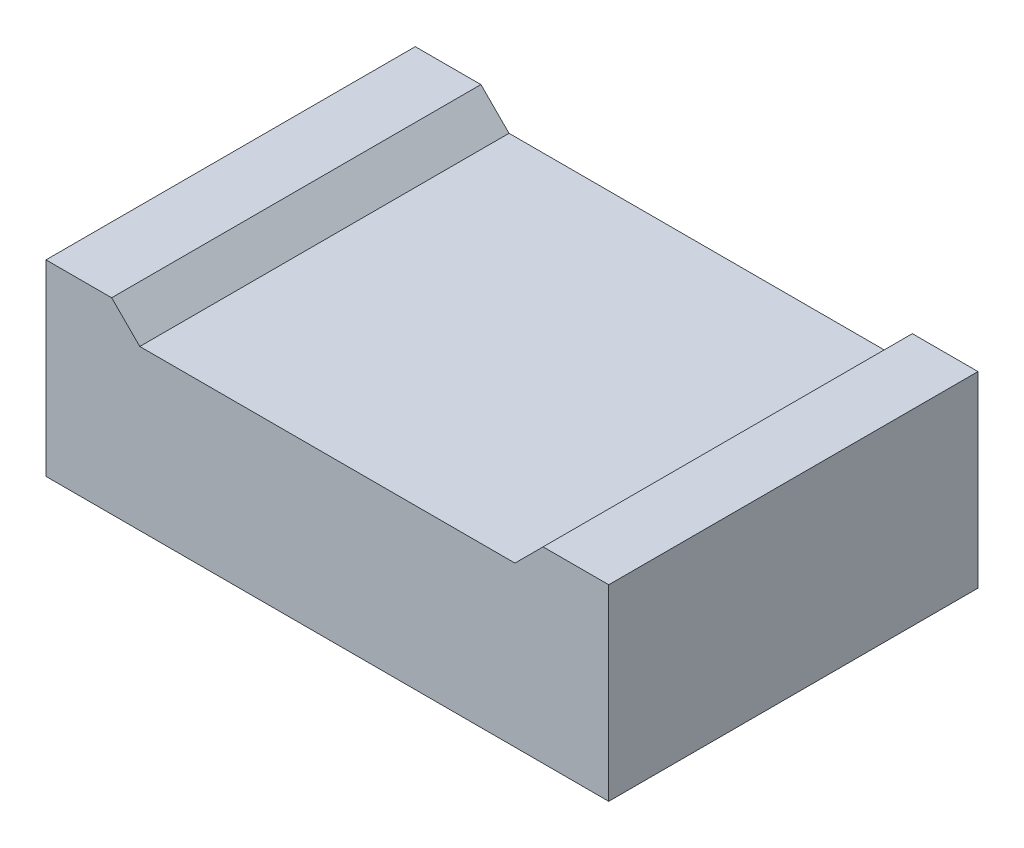
ISO-10303-21;
HEADER;
FILE_DESCRIPTION(('STEP AP214'),'2;1');
FILE_NAME('part.step','',(''),(''),'','','');
FILE_SCHEMA(('AUTOMOTIVE_DESIGN { 1 0 10303 214 1 1 1 1 }'));
ENDSEC;
DATA;
#1=APPLICATION_CONTEXT('core data for automotive mechanical design processes');
#2=APPLICATION_PROTOCOL_DEFINITION('international standard','automotive_design',2000,#1);
#3=PRODUCT_CONTEXT('',#1,'mechanical');
#4=PRODUCT('Part','Part','',(#3));
#5=PRODUCT_RELATED_PRODUCT_CATEGORY('part','',(#4));
#6=PRODUCT_DEFINITION_FORMATION('','',#4);
#7=PRODUCT_DEFINITION_CONTEXT('part definition',#1,'design');
#8=PRODUCT_DEFINITION('design','',#6,#7);
#9=PRODUCT_DEFINITION_SHAPE('','',#8);
#10=(LENGTH_UNIT() NAMED_UNIT(*) SI_UNIT(.MILLI.,.METRE.));
#11=(NAMED_UNIT(*) PLANE_ANGLE_UNIT() SI_UNIT($,.RADIAN.));
#12=(NAMED_UNIT(*) SI_UNIT($,.STERADIAN.) SOLID_ANGLE_UNIT());
#13=UNCERTAINTY_MEASURE_WITH_UNIT(LENGTH_MEASURE(1.E-05),#10,'distance_accuracy_value','');
#14=(GEOMETRIC_REPRESENTATION_CONTEXT(3) GLOBAL_UNCERTAINTY_ASSIGNED_CONTEXT((#13)) GLOBAL_UNIT_ASSIGNED_CONTEXT((#10,
#11,#12)) REPRESENTATION_CONTEXT('',''));
#15=CARTESIAN_POINT('',(0.,0.,0.));
#16=DIRECTION('',(0.,0.,1.));
#17=DIRECTION('',(1.,0.,0.));
#18=AXIS2_PLACEMENT_3D('',#15,#16,#17);
#19=CARTESIAN_POINT('',(-2.921,1.27,0.));
#20=DIRECTION('',(0.707106781186548,0.707106781186548,0.));
#21=DIRECTION('',(-0.707106781186548,0.707106781186548,0.));
#22=AXIS2_PLACEMENT_3D('',#19,#20,#21);
#23=PLANE('',#22);
#24=DIRECTION('',(0.,0.,1.));
#25=VECTOR('',#24,1.);
#26=CARTESIAN_POINT('',(-2.54,0.889,0.));
#27=LINE('',#26,#25);
#28=CARTESIAN_POINT('',(-2.54,0.889,0.));
#29=VERTEX_POINT('',#28);
#30=CARTESIAN_POINT('',(-2.54,0.889,5.));
#31=VERTEX_POINT('',#30);
#32=EDGE_CURVE('E116',#29,#31,#27,.T.);
#33=ORIENTED_EDGE('',*,*,#32,.F.);
#34=DIRECTION('',(-0.707106781186548,0.707106781186548,0.));
#35=VECTOR('',#34,1.);
#36=CARTESIAN_POINT('',(-2.921,1.27,0.));
#37=LINE('',#36,#35);
#38=CARTESIAN_POINT('',(-2.921,1.27,0.));
#39=VERTEX_POINT('',#38);
#40=EDGE_CURVE('E95',#29,#39,#37,.T.);
#41=ORIENTED_EDGE('',*,*,#40,.T.);
#42=DIRECTION('',(0.,0.,1.));
#43=VECTOR('',#42,1.);
#44=CARTESIAN_POINT('',(-2.921,1.27,0.));
#45=LINE('',#44,#43);
#46=CARTESIAN_POINT('',(-2.921,1.27,5.));
#47=VERTEX_POINT('',#46);
#48=EDGE_CURVE('E119',#47,#39,#45,.F.);
#49=ORIENTED_EDGE('',*,*,#48,.F.);
#50=DIRECTION('',(-0.707106781186548,0.707106781186548,0.));
#51=VECTOR('',#50,1.);
#52=CARTESIAN_POINT('',(-2.921,1.27,5.));
#53=LINE('',#52,#51);
#54=EDGE_CURVE('E20',#47,#31,#53,.F.);
#55=ORIENTED_EDGE('',*,*,#54,.T.);
#56=EDGE_LOOP('',(#33,#41,#49,#55));
#57=FACE_BOUND('',#56,.T.);
#58=ADVANCED_FACE('F17',(#57),#23,.T.);
#59=CARTESIAN_POINT('',(2.54,0.889,0.));
#60=DIRECTION('',(-0.707106781186548,0.707106781186548,0.));
#61=DIRECTION('',(-0.707106781186548,-0.707106781186548,0.));
#62=AXIS2_PLACEMENT_3D('',#59,#60,#61);
#63=PLANE('',#62);
#64=DIRECTION('',(0.,0.,1.));
#65=VECTOR('',#64,1.);
#66=CARTESIAN_POINT('',(2.921,1.27,0.));
#67=LINE('',#66,#65);
#68=CARTESIAN_POINT('',(2.921,1.27,0.));
#69=VERTEX_POINT('',#68);
#70=CARTESIAN_POINT('',(2.921,1.27,5.));
#71=VERTEX_POINT('',#70);
#72=EDGE_CURVE('E88',#69,#71,#67,.T.);
#73=ORIENTED_EDGE('',*,*,#72,.F.);
#74=DIRECTION('',(-0.707106781186548,-0.707106781186548,0.));
#75=VECTOR('',#74,1.);
#76=CARTESIAN_POINT('',(2.54,0.889,0.));
#77=LINE('',#76,#75);
#78=CARTESIAN_POINT('',(2.54,0.889,0.));
#79=VERTEX_POINT('',#78);
#80=EDGE_CURVE('E79',#69,#79,#77,.T.);
#81=ORIENTED_EDGE('',*,*,#80,.T.);
#82=DIRECTION('',(0.,0.,1.));
#83=VECTOR('',#82,1.);
#84=CARTESIAN_POINT('',(2.54,0.889,0.));
#85=LINE('',#84,#83);
#86=CARTESIAN_POINT('',(2.54,0.889,5.));
#87=VERTEX_POINT('',#86);
#88=EDGE_CURVE('E91',#87,#79,#85,.F.);
#89=ORIENTED_EDGE('',*,*,#88,.F.);
#90=DIRECTION('',(-0.707106781186548,-0.707106781186548,0.));
#91=VECTOR('',#90,1.);
#92=CARTESIAN_POINT('',(2.54,0.889,5.));
#93=LINE('',#92,#91);
#94=EDGE_CURVE('E84',#87,#71,#93,.F.);
#95=ORIENTED_EDGE('',*,*,#94,.T.);
#96=EDGE_LOOP('',(#73,#81,#89,#95));
#97=FACE_BOUND('',#96,.T.);
#98=ADVANCED_FACE('F86',(#97),#63,.T.);
#99=CARTESIAN_POINT('',(2.921,1.27,0.));
#100=DIRECTION('',(0.,1.,0.));
#101=DIRECTION('',(0.,0.,1.));
#102=AXIS2_PLACEMENT_3D('',#99,#100,#101);
#103=PLANE('',#102);
#104=DIRECTION('',(0.,0.,-1.));
#105=VECTOR('',#104,1.);
#106=CARTESIAN_POINT('',(3.81,1.27,0.));
#107=LINE('',#106,#105);
#108=CARTESIAN_POINT('',(3.81,1.27,0.));
#109=VERTEX_POINT('',#108);
#110=CARTESIAN_POINT('',(3.81,1.27,5.));
#111=VERTEX_POINT('',#110);
#112=EDGE_CURVE('E131',#109,#111,#107,.F.);
#113=ORIENTED_EDGE('',*,*,#112,.F.);
#114=DIRECTION('',(1.,0.,0.));
#115=VECTOR('',#114,1.);
#116=CARTESIAN_POINT('',(2.921,1.27,0.));
#117=LINE('',#116,#115);
#118=EDGE_CURVE('E105',#109,#69,#117,.F.);
#119=ORIENTED_EDGE('',*,*,#118,.T.);
#120=ORIENTED_EDGE('',*,*,#72,.T.);
#121=DIRECTION('',(1.,0.,0.));
#122=VECTOR('',#121,1.);
#123=CARTESIAN_POINT('',(2.921,1.27,5.));
#124=LINE('',#123,#122);
#125=EDGE_CURVE('E98',#71,#111,#124,.T.);
#126=ORIENTED_EDGE('',*,*,#125,.T.);
#127=EDGE_LOOP('',(#113,#119,#120,#126));
#128=FACE_BOUND('',#127,.T.);
#129=ADVANCED_FACE('F107',(#128),#103,.T.);
#130=CARTESIAN_POINT('',(-3.81,1.27,0.));
#131=DIRECTION('',(0.,1.,0.));
#132=DIRECTION('',(0.,0.,1.));
#133=AXIS2_PLACEMENT_3D('',#130,#131,#132);
#134=PLANE('',#133);
#135=ORIENTED_EDGE('',*,*,#48,.T.);
#136=DIRECTION('',(1.,0.,0.));
#137=VECTOR('',#136,1.);
#138=CARTESIAN_POINT('',(-3.81,1.27,0.));
#139=LINE('',#138,#137);
#140=CARTESIAN_POINT('',(-3.81,1.27,0.));
#141=VERTEX_POINT('',#140);
#142=EDGE_CURVE('E125',#39,#141,#139,.F.);
#143=ORIENTED_EDGE('',*,*,#142,.T.);
#144=DIRECTION('',(0.,0.,1.));
#145=VECTOR('',#144,1.);
#146=CARTESIAN_POINT('',(-3.81,1.27,0.));
#147=LINE('',#146,#145);
#148=CARTESIAN_POINT('',(-3.81,1.27,5.));
#149=VERTEX_POINT('',#148);
#150=EDGE_CURVE('E141',#149,#141,#147,.F.);
#151=ORIENTED_EDGE('',*,*,#150,.F.);
#152=DIRECTION('',(1.,0.,0.));
#153=VECTOR('',#152,1.);
#154=CARTESIAN_POINT('',(-3.81,1.27,5.));
#155=LINE('',#154,#153);
#156=EDGE_CURVE('E127',#47,#149,#155,.F.);
#157=ORIENTED_EDGE('',*,*,#156,.F.);
#158=EDGE_LOOP('',(#135,#143,#151,#157));
#159=FACE_BOUND('',#158,.T.);
#160=ADVANCED_FACE('F139',(#159),#134,.T.);
#161=CARTESIAN_POINT('',(-2.54,0.889,0.));
#162=DIRECTION('',(0.,1.,0.));
#163=DIRECTION('',(0.,0.,1.));
#164=AXIS2_PLACEMENT_3D('',#161,#162,#163);
#165=PLANE('',#164);
#166=ORIENTED_EDGE('',*,*,#88,.T.);
#167=DIRECTION('',(1.,0.,0.));
#168=VECTOR('',#167,1.);
#169=CARTESIAN_POINT('',(-3.81,0.889,0.));
#170=LINE('',#169,#168);
#171=EDGE_CURVE('E124',#79,#29,#170,.F.);
#172=ORIENTED_EDGE('',*,*,#171,.T.);
#173=ORIENTED_EDGE('',*,*,#32,.T.);
#174=DIRECTION('',(1.,0.,0.));
#175=VECTOR('',#174,1.);
#176=CARTESIAN_POINT('',(-3.81,0.889,5.));
#177=LINE('',#176,#175);
#178=EDGE_CURVE('E123',#87,#31,#177,.F.);
#179=ORIENTED_EDGE('',*,*,#178,.F.);
#180=EDGE_LOOP('',(#166,#172,#173,#179));
#181=FACE_BOUND('',#180,.T.);
#182=ADVANCED_FACE('F122',(#181),#165,.T.);
#183=CARTESIAN_POINT('',(3.81,1.27,0.));
#184=DIRECTION('',(1.,0.,0.));
#185=DIRECTION('',(0.,0.,-1.));
#186=AXIS2_PLACEMENT_3D('',#183,#184,#185);
#187=PLANE('',#186);
#188=DIRECTION('',(0.,0.,-1.));
#189=VECTOR('',#188,1.);
#190=CARTESIAN_POINT('',(3.81,-1.27,0.));
#191=LINE('',#190,#189);
#192=CARTESIAN_POINT('',(3.81,-1.27,0.));
#193=VERTEX_POINT('',#192);
#194=CARTESIAN_POINT('',(3.81,-1.27,5.));
#195=VERTEX_POINT('',#194);
#196=EDGE_CURVE('E151',#193,#195,#191,.F.);
#197=ORIENTED_EDGE('',*,*,#196,.F.);
#198=DIRECTION('',(0.,1.,0.));
#199=VECTOR('',#198,1.);
#200=CARTESIAN_POINT('',(3.81,-1.27,0.));
#201=LINE('',#200,#199);
#202=EDGE_CURVE('E157',#193,#109,#201,.T.);
#203=ORIENTED_EDGE('',*,*,#202,.T.);
#204=ORIENTED_EDGE('',*,*,#112,.T.);
#205=DIRECTION('',(0.,1.,0.));
#206=VECTOR('',#205,1.);
#207=CARTESIAN_POINT('',(3.81,-1.27,5.));
#208=LINE('',#207,#206);
#209=EDGE_CURVE('E101',#195,#111,#208,.T.);
#210=ORIENTED_EDGE('',*,*,#209,.F.);
#211=EDGE_LOOP('',(#197,#203,#204,#210));
#212=FACE_BOUND('',#211,.T.);
#213=ADVANCED_FACE('F163',(#212),#187,.T.);
#214=CARTESIAN_POINT('',(-3.81,-1.27,5.));
#215=DIRECTION('',(0.,0.,1.));
#216=DIRECTION('',(1.,0.,0.));
#217=AXIS2_PLACEMENT_3D('',#214,#215,#216);
#218=PLANE('',#217);
#219=ORIENTED_EDGE('',*,*,#156,.T.);
#220=DIRECTION('',(0.,1.,0.));
#221=VECTOR('',#220,1.);
#222=CARTESIAN_POINT('',(-3.81,-1.27,5.));
#223=LINE('',#222,#221);
#224=CARTESIAN_POINT('',(-3.81,-1.27,5.));
#225=VERTEX_POINT('',#224);
#226=EDGE_CURVE('E129',#225,#149,#223,.T.);
#227=ORIENTED_EDGE('',*,*,#226,.F.);
#228=DIRECTION('',(1.,0.,0.));
#229=VECTOR('',#228,1.);
#230=CARTESIAN_POINT('',(3.81,-1.27,5.));
#231=LINE('',#230,#229);
#232=EDGE_CURVE('E144',#195,#225,#231,.F.);
#233=ORIENTED_EDGE('',*,*,#232,.F.);
#234=ORIENTED_EDGE('',*,*,#209,.T.);
#235=ORIENTED_EDGE('',*,*,#125,.F.);
#236=ORIENTED_EDGE('',*,*,#94,.F.);
#237=ORIENTED_EDGE('',*,*,#178,.T.);
#238=ORIENTED_EDGE('',*,*,#54,.F.);
#239=EDGE_LOOP('',(#219,#227,#233,#234,#235,#236,#237,#238));
#240=FACE_BOUND('',#239,.T.);
#241=ADVANCED_FACE('F99',(#240),#218,.T.);
#242=CARTESIAN_POINT('',(-3.81,-1.27,0.));
#243=DIRECTION('',(-1.,0.,0.));
#244=DIRECTION('',(0.,0.,1.));
#245=AXIS2_PLACEMENT_3D('',#242,#243,#244);
#246=PLANE('',#245);
#247=ORIENTED_EDGE('',*,*,#150,.T.);
#248=DIRECTION('',(0.,1.,0.));
#249=VECTOR('',#248,1.);
#250=CARTESIAN_POINT('',(-3.81,-1.27,0.));
#251=LINE('',#250,#249);
#252=CARTESIAN_POINT('',(-3.81,-1.27,0.));
#253=VERTEX_POINT('',#252);
#254=EDGE_CURVE('E35',#141,#253,#251,.F.);
#255=ORIENTED_EDGE('',*,*,#254,.T.);
#256=DIRECTION('',(0.,0.,-1.));
#257=VECTOR('',#256,1.);
#258=CARTESIAN_POINT('',(-3.81,-1.27,0.));
#259=LINE('',#258,#257);
#260=EDGE_CURVE('E26',#225,#253,#259,.T.);
#261=ORIENTED_EDGE('',*,*,#260,.F.);
#262=ORIENTED_EDGE('',*,*,#226,.T.);
#263=EDGE_LOOP('',(#247,#255,#261,#262));
#264=FACE_BOUND('',#263,.T.);
#265=ADVANCED_FACE('F147',(#264),#246,.T.);
#266=CARTESIAN_POINT('',(-3.81,-1.27,0.));
#267=DIRECTION('',(0.,0.,1.));
#268=DIRECTION('',(1.,0.,0.));
#269=AXIS2_PLACEMENT_3D('',#266,#267,#268);
#270=PLANE('',#269);
#271=ORIENTED_EDGE('',*,*,#142,.F.);
#272=ORIENTED_EDGE('',*,*,#40,.F.);
#273=ORIENTED_EDGE('',*,*,#171,.F.);
#274=ORIENTED_EDGE('',*,*,#80,.F.);
#275=ORIENTED_EDGE('',*,*,#118,.F.);
#276=ORIENTED_EDGE('',*,*,#202,.F.);
#277=DIRECTION('',(1.,0.,0.));
#278=VECTOR('',#277,1.);
#279=CARTESIAN_POINT('',(3.81,-1.27,0.));
#280=LINE('',#279,#278);
#281=EDGE_CURVE('E11',#253,#193,#280,.T.);
#282=ORIENTED_EDGE('',*,*,#281,.F.);
#283=ORIENTED_EDGE('',*,*,#254,.F.);
#284=EDGE_LOOP('',(#271,#272,#273,#274,#275,#276,#282,#283));
#285=FACE_BOUND('',#284,.T.);
#286=ADVANCED_FACE('F160',(#285),#270,.F.);
#287=CARTESIAN_POINT('',(3.81,-1.27,0.));
#288=DIRECTION('',(0.,-1.,0.));
#289=DIRECTION('',(0.,0.,-1.));
#290=AXIS2_PLACEMENT_3D('',#287,#288,#289);
#291=PLANE('',#290);
#292=ORIENTED_EDGE('',*,*,#260,.T.);
#293=ORIENTED_EDGE('',*,*,#281,.T.);
#294=ORIENTED_EDGE('',*,*,#196,.T.);
#295=ORIENTED_EDGE('',*,*,#232,.T.);
#296=EDGE_LOOP('',(#292,#293,#294,#295));
#297=FACE_BOUND('',#296,.T.);
#298=ADVANCED_FACE('F150',(#297),#291,.T.);
#299=CLOSED_SHELL('',(#58,#98,#129,#160,#182,#213,#241,#265,#286,#298));
#300=MANIFOLD_SOLID_BREP('B1',#299);
#301=ADVANCED_BREP_SHAPE_REPRESENTATION('',(#18,#300),#14);
#302=SHAPE_DEFINITION_REPRESENTATION(#9,#301);
ENDSEC;
END-ISO-10303-21;
